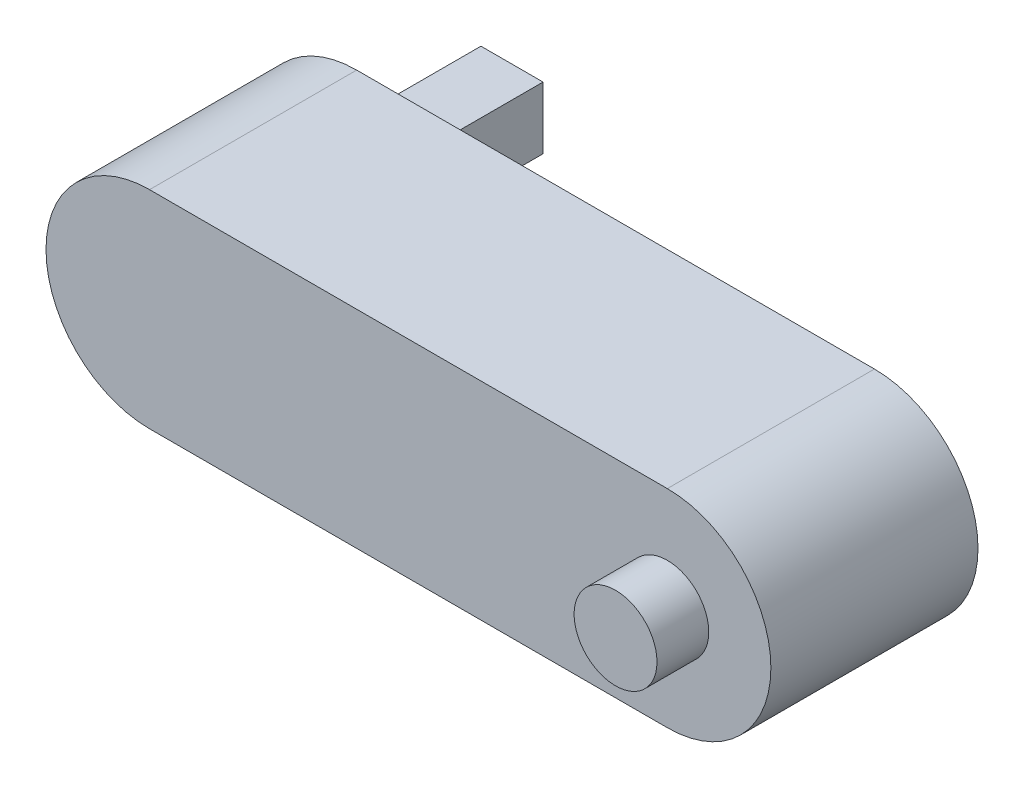
ISO-10303-21;
HEADER;
FILE_DESCRIPTION(('STEP AP214'),'2;1');
FILE_NAME('part.step','',(''),(''),'','','');
FILE_SCHEMA(('AUTOMOTIVE_DESIGN { 1 0 10303 214 1 1 1 1 }'));
ENDSEC;
DATA;
#1=APPLICATION_CONTEXT('core data for automotive mechanical design processes');
#2=APPLICATION_PROTOCOL_DEFINITION('international standard','automotive_design',2000,#1);
#3=PRODUCT_CONTEXT('',#1,'mechanical');
#4=PRODUCT('Part','Part','',(#3));
#5=PRODUCT_RELATED_PRODUCT_CATEGORY('part','',(#4));
#6=PRODUCT_DEFINITION_FORMATION('','',#4);
#7=PRODUCT_DEFINITION_CONTEXT('part definition',#1,'design');
#8=PRODUCT_DEFINITION('design','',#6,#7);
#9=PRODUCT_DEFINITION_SHAPE('','',#8);
#10=(LENGTH_UNIT() NAMED_UNIT(*) SI_UNIT(.MILLI.,.METRE.));
#11=(NAMED_UNIT(*) PLANE_ANGLE_UNIT() SI_UNIT($,.RADIAN.));
#12=(NAMED_UNIT(*) SI_UNIT($,.STERADIAN.) SOLID_ANGLE_UNIT());
#13=UNCERTAINTY_MEASURE_WITH_UNIT(LENGTH_MEASURE(1.E-05),#10,'distance_accuracy_value','');
#14=(GEOMETRIC_REPRESENTATION_CONTEXT(3) GLOBAL_UNCERTAINTY_ASSIGNED_CONTEXT((#13)) GLOBAL_UNIT_ASSIGNED_CONTEXT((#10,
#11,#12)) REPRESENTATION_CONTEXT('',''));
#15=CARTESIAN_POINT('',(0.,0.,0.));
#16=DIRECTION('',(0.,0.,1.));
#17=DIRECTION('',(1.,0.,0.));
#18=AXIS2_PLACEMENT_3D('',#15,#16,#17);
#19=CARTESIAN_POINT('',(0.,0.,0.));
#20=DIRECTION('',(0.,0.,1.));
#21=DIRECTION('',(1.,0.,0.));
#22=AXIS2_PLACEMENT_3D('',#19,#20,#21);
#23=PLANE('',#22);
#24=CARTESIAN_POINT('',(0.,0.,0.));
#25=DIRECTION('',(0.,0.,1.));
#26=DIRECTION('',(1.,0.,0.));
#27=AXIS2_PLACEMENT_3D('',#24,#25,#26);
#28=CIRCLE('',#27,10.);
#29=CARTESIAN_POINT('',(0.,10.,0.));
#30=VERTEX_POINT('',#29);
#31=CARTESIAN_POINT('',(0.,-10.,0.));
#32=VERTEX_POINT('',#31);
#33=EDGE_CURVE('E150',#30,#32,#28,.T.);
#34=ORIENTED_EDGE('',*,*,#33,.F.);
#35=DIRECTION('',(-1.,0.,0.));
#36=VECTOR('',#35,1.);
#37=CARTESIAN_POINT('',(0.,10.,0.));
#38=LINE('',#37,#36);
#39=CARTESIAN_POINT('',(50.,10.,0.));
#40=VERTEX_POINT('',#39);
#41=EDGE_CURVE('E157',#40,#30,#38,.T.);
#42=ORIENTED_EDGE('',*,*,#41,.F.);
#43=CARTESIAN_POINT('',(50.,0.,0.));
#44=DIRECTION('',(0.,0.,1.));
#45=DIRECTION('',(1.,0.,0.));
#46=AXIS2_PLACEMENT_3D('',#43,#44,#45);
#47=CIRCLE('',#46,10.);
#48=CARTESIAN_POINT('',(50.,-10.,0.));
#49=VERTEX_POINT('',#48);
#50=EDGE_CURVE('E173',#49,#40,#47,.T.);
#51=ORIENTED_EDGE('',*,*,#50,.F.);
#52=DIRECTION('',(1.,0.,0.));
#53=VECTOR('',#52,1.);
#54=CARTESIAN_POINT('',(0.,-10.,0.));
#55=LINE('',#54,#53);
#56=EDGE_CURVE('E170',#32,#49,#55,.T.);
#57=ORIENTED_EDGE('',*,*,#56,.F.);
#58=EDGE_LOOP('',(#34,#42,#51,#57));
#59=FACE_BOUND('',#58,.T.);
#60=DIRECTION('',(0.,1.,0.));
#61=VECTOR('',#60,1.);
#62=CARTESIAN_POINT('',(-3.,-3.,0.));
#63=LINE('',#62,#61);
#64=CARTESIAN_POINT('',(-3.,-3.,0.));
#65=VERTEX_POINT('',#64);
#66=CARTESIAN_POINT('',(-3.,3.,0.));
#67=VERTEX_POINT('',#66);
#68=EDGE_CURVE('E135',#65,#67,#63,.T.);
#69=ORIENTED_EDGE('',*,*,#68,.F.);
#70=DIRECTION('',(-1.,0.,0.));
#71=VECTOR('',#70,1.);
#72=CARTESIAN_POINT('',(3.,-3.,0.));
#73=LINE('',#72,#71);
#74=CARTESIAN_POINT('',(3.,-3.,0.));
#75=VERTEX_POINT('',#74);
#76=EDGE_CURVE('E132',#75,#65,#73,.T.);
#77=ORIENTED_EDGE('',*,*,#76,.F.);
#78=DIRECTION('',(0.,-1.,0.));
#79=VECTOR('',#78,1.);
#80=CARTESIAN_POINT('',(3.,-3.,0.));
#81=LINE('',#80,#79);
#82=CARTESIAN_POINT('',(3.,3.,0.));
#83=VERTEX_POINT('',#82);
#84=EDGE_CURVE('E68',#83,#75,#81,.T.);
#85=ORIENTED_EDGE('',*,*,#84,.F.);
#86=DIRECTION('',(1.,0.,0.));
#87=VECTOR('',#86,1.);
#88=CARTESIAN_POINT('',(3.,3.,0.));
#89=LINE('',#88,#87);
#90=EDGE_CURVE('E63',#67,#83,#89,.T.);
#91=ORIENTED_EDGE('',*,*,#90,.F.);
#92=EDGE_LOOP('',(#69,#77,#85,#91));
#93=FACE_BOUND('',#92,.T.);
#94=ADVANCED_FACE('F47',(#59,#93),#23,.F.);
#95=CARTESIAN_POINT('',(0.,0.,20.));
#96=DIRECTION('',(0.,0.,-1.));
#97=DIRECTION('',(-1.,0.,0.));
#98=AXIS2_PLACEMENT_3D('',#95,#96,#97);
#99=CYLINDRICAL_SURFACE('',#98,10.);
#100=ORIENTED_EDGE('',*,*,#33,.T.);
#101=DIRECTION('',(0.,0.,-1.));
#102=VECTOR('',#101,1.);
#103=CARTESIAN_POINT('',(0.,-10.,20.));
#104=LINE('',#103,#102);
#105=CARTESIAN_POINT('',(0.,-10.,20.));
#106=VERTEX_POINT('',#105);
#107=EDGE_CURVE('E11',#106,#32,#104,.T.);
#108=ORIENTED_EDGE('',*,*,#107,.F.);
#109=CARTESIAN_POINT('',(0.,0.,20.));
#110=DIRECTION('',(0.,0.,1.));
#111=DIRECTION('',(1.,0.,0.));
#112=AXIS2_PLACEMENT_3D('',#109,#110,#111);
#113=CIRCLE('',#112,10.);
#114=CARTESIAN_POINT('',(0.,10.,20.));
#115=VERTEX_POINT('',#114);
#116=EDGE_CURVE('E152',#115,#106,#113,.T.);
#117=ORIENTED_EDGE('',*,*,#116,.F.);
#118=DIRECTION('',(0.,0.,-1.));
#119=VECTOR('',#118,1.);
#120=CARTESIAN_POINT('',(0.,10.,20.));
#121=LINE('',#120,#119);
#122=EDGE_CURVE('E166',#115,#30,#121,.T.);
#123=ORIENTED_EDGE('',*,*,#122,.T.);
#124=EDGE_LOOP('',(#100,#108,#117,#123));
#125=FACE_BOUND('',#124,.T.);
#126=ADVANCED_FACE('F49',(#125),#99,.T.);
#127=CARTESIAN_POINT('',(0.,-10.,20.));
#128=DIRECTION('',(0.,1.,0.));
#129=DIRECTION('',(0.,0.,1.));
#130=AXIS2_PLACEMENT_3D('',#127,#128,#129);
#131=PLANE('',#130);
#132=ORIENTED_EDGE('',*,*,#56,.T.);
#133=DIRECTION('',(0.,0.,-1.));
#134=VECTOR('',#133,1.);
#135=CARTESIAN_POINT('',(50.,-10.,20.));
#136=LINE('',#135,#134);
#137=CARTESIAN_POINT('',(50.,-10.,20.));
#138=VERTEX_POINT('',#137);
#139=EDGE_CURVE('E56',#138,#49,#136,.T.);
#140=ORIENTED_EDGE('',*,*,#139,.F.);
#141=DIRECTION('',(1.,0.,0.));
#142=VECTOR('',#141,1.);
#143=CARTESIAN_POINT('',(0.,-10.,20.));
#144=LINE('',#143,#142);
#145=EDGE_CURVE('E156',#106,#138,#144,.T.);
#146=ORIENTED_EDGE('',*,*,#145,.F.);
#147=ORIENTED_EDGE('',*,*,#107,.T.);
#148=EDGE_LOOP('',(#132,#140,#146,#147));
#149=FACE_BOUND('',#148,.T.);
#150=ADVANCED_FACE('F205',(#149),#131,.F.);
#151=CARTESIAN_POINT('',(50.,0.,20.));
#152=DIRECTION('',(0.,0.,-1.));
#153=DIRECTION('',(-1.,0.,0.));
#154=AXIS2_PLACEMENT_3D('',#151,#152,#153);
#155=CYLINDRICAL_SURFACE('',#154,10.);
#156=ORIENTED_EDGE('',*,*,#50,.T.);
#157=DIRECTION('',(0.,0.,-1.));
#158=VECTOR('',#157,1.);
#159=CARTESIAN_POINT('',(50.,10.,20.));
#160=LINE('',#159,#158);
#161=CARTESIAN_POINT('',(50.,10.,20.));
#162=VERTEX_POINT('',#161);
#163=EDGE_CURVE('E181',#162,#40,#160,.T.);
#164=ORIENTED_EDGE('',*,*,#163,.F.);
#165=CARTESIAN_POINT('',(50.,0.,20.));
#166=DIRECTION('',(0.,0.,1.));
#167=DIRECTION('',(1.,0.,0.));
#168=AXIS2_PLACEMENT_3D('',#165,#166,#167);
#169=CIRCLE('',#168,10.);
#170=EDGE_CURVE('E160',#138,#162,#169,.T.);
#171=ORIENTED_EDGE('',*,*,#170,.F.);
#172=ORIENTED_EDGE('',*,*,#139,.T.);
#173=EDGE_LOOP('',(#156,#164,#171,#172));
#174=FACE_BOUND('',#173,.T.);
#175=ADVANCED_FACE('F190',(#174),#155,.T.);
#176=CARTESIAN_POINT('',(0.,10.,20.));
#177=DIRECTION('',(0.,-1.,0.));
#178=DIRECTION('',(0.,0.,-1.));
#179=AXIS2_PLACEMENT_3D('',#176,#177,#178);
#180=PLANE('',#179);
#181=ORIENTED_EDGE('',*,*,#41,.T.);
#182=ORIENTED_EDGE('',*,*,#122,.F.);
#183=DIRECTION('',(-1.,0.,0.));
#184=VECTOR('',#183,1.);
#185=CARTESIAN_POINT('',(0.,10.,20.));
#186=LINE('',#185,#184);
#187=EDGE_CURVE('E163',#162,#115,#186,.T.);
#188=ORIENTED_EDGE('',*,*,#187,.F.);
#189=ORIENTED_EDGE('',*,*,#163,.T.);
#190=EDGE_LOOP('',(#181,#182,#188,#189));
#191=FACE_BOUND('',#190,.T.);
#192=ADVANCED_FACE('F198',(#191),#180,.F.);
#193=CARTESIAN_POINT('',(0.,0.,20.));
#194=DIRECTION('',(0.,0.,1.));
#195=DIRECTION('',(1.,0.,0.));
#196=AXIS2_PLACEMENT_3D('',#193,#194,#195);
#197=PLANE('',#196);
#198=CARTESIAN_POINT('',(50.,0.,20.));
#199=DIRECTION('',(0.,0.,1.));
#200=DIRECTION('',(1.,0.,0.));
#201=AXIS2_PLACEMENT_3D('',#198,#199,#200);
#202=CIRCLE('',#201,4.00000000000001);
#203=CARTESIAN_POINT('',(54.,0.,20.));
#204=VERTEX_POINT('',#203);
#205=EDGE_CURVE('E137',#204,#204,#202,.T.);
#206=ORIENTED_EDGE('',*,*,#205,.F.);
#207=EDGE_LOOP('',(#206));
#208=FACE_BOUND('',#207,.T.);
#209=ORIENTED_EDGE('',*,*,#116,.T.);
#210=ORIENTED_EDGE('',*,*,#145,.T.);
#211=ORIENTED_EDGE('',*,*,#170,.T.);
#212=ORIENTED_EDGE('',*,*,#187,.T.);
#213=EDGE_LOOP('',(#209,#210,#211,#212));
#214=FACE_BOUND('',#213,.T.);
#215=ADVANCED_FACE('F204',(#208,#214),#197,.T.);
#216=CARTESIAN_POINT('',(50.,0.,25.));
#217=DIRECTION('',(0.,0.,-1.));
#218=DIRECTION('',(-1.,0.,0.));
#219=AXIS2_PLACEMENT_3D('',#216,#217,#218);
#220=CYLINDRICAL_SURFACE('',#219,4.00000000000001);
#221=CARTESIAN_POINT('',(50.,0.,25.));
#222=DIRECTION('',(0.,0.,1.));
#223=DIRECTION('',(1.,0.,0.));
#224=AXIS2_PLACEMENT_3D('',#221,#222,#223);
#225=CIRCLE('',#224,4.00000000000001);
#226=CARTESIAN_POINT('',(54.,0.,25.));
#227=VERTEX_POINT('',#226);
#228=EDGE_CURVE('E142',#227,#227,#225,.T.);
#229=ORIENTED_EDGE('',*,*,#228,.F.);
#230=EDGE_LOOP('',(#229));
#231=FACE_BOUND('',#230,.T.);
#232=ORIENTED_EDGE('',*,*,#205,.T.);
#233=EDGE_LOOP('',(#232));
#234=FACE_BOUND('',#233,.T.);
#235=ADVANCED_FACE('F225',(#231,#234),#220,.T.);
#236=CARTESIAN_POINT('',(0.,0.,25.));
#237=DIRECTION('',(0.,0.,1.));
#238=DIRECTION('',(1.,0.,0.));
#239=AXIS2_PLACEMENT_3D('',#236,#237,#238);
#240=PLANE('',#239);
#241=ORIENTED_EDGE('',*,*,#228,.T.);
#242=EDGE_LOOP('',(#241));
#243=FACE_BOUND('',#242,.T.);
#244=ADVANCED_FACE('F230',(#243),#240,.T.);
#245=CARTESIAN_POINT('',(-3.,-3.,-15.));
#246=DIRECTION('',(1.,0.,0.));
#247=DIRECTION('',(0.,0.,-1.));
#248=AXIS2_PLACEMENT_3D('',#245,#246,#247);
#249=PLANE('',#248);
#250=ORIENTED_EDGE('',*,*,#68,.T.);
#251=DIRECTION('',(0.,0.,1.));
#252=VECTOR('',#251,1.);
#253=CARTESIAN_POINT('',(-3.,3.,-15.));
#254=LINE('',#253,#252);
#255=CARTESIAN_POINT('',(-3.,3.,-15.));
#256=VERTEX_POINT('',#255);
#257=EDGE_CURVE('E114',#256,#67,#254,.T.);
#258=ORIENTED_EDGE('',*,*,#257,.F.);
#259=DIRECTION('',(0.,1.,0.));
#260=VECTOR('',#259,1.);
#261=CARTESIAN_POINT('',(-3.,-3.,-15.));
#262=LINE('',#261,#260);
#263=CARTESIAN_POINT('',(-3.,-3.,-15.));
#264=VERTEX_POINT('',#263);
#265=EDGE_CURVE('E122',#264,#256,#262,.T.);
#266=ORIENTED_EDGE('',*,*,#265,.F.);
#267=DIRECTION('',(0.,0.,1.));
#268=VECTOR('',#267,1.);
#269=CARTESIAN_POINT('',(-3.,-3.,-15.));
#270=LINE('',#269,#268);
#271=EDGE_CURVE('E322',#264,#65,#270,.T.);
#272=ORIENTED_EDGE('',*,*,#271,.T.);
#273=EDGE_LOOP('',(#250,#258,#266,#272));
#274=FACE_BOUND('',#273,.T.);
#275=ADVANCED_FACE('F134',(#274),#249,.F.);
#276=CARTESIAN_POINT('',(3.,3.,-15.));
#277=DIRECTION('',(0.,-1.,0.));
#278=DIRECTION('',(0.,0.,-1.));
#279=AXIS2_PLACEMENT_3D('',#276,#277,#278);
#280=PLANE('',#279);
#281=ORIENTED_EDGE('',*,*,#90,.T.);
#282=DIRECTION('',(0.,0.,1.));
#283=VECTOR('',#282,1.);
#284=CARTESIAN_POINT('',(3.,3.,-15.));
#285=LINE('',#284,#283);
#286=CARTESIAN_POINT('',(3.,3.,-15.));
#287=VERTEX_POINT('',#286);
#288=EDGE_CURVE('E117',#287,#83,#285,.T.);
#289=ORIENTED_EDGE('',*,*,#288,.F.);
#290=DIRECTION('',(1.,0.,0.));
#291=VECTOR('',#290,1.);
#292=CARTESIAN_POINT('',(3.,3.,-15.));
#293=LINE('',#292,#291);
#294=EDGE_CURVE('E110',#256,#287,#293,.T.);
#295=ORIENTED_EDGE('',*,*,#294,.F.);
#296=ORIENTED_EDGE('',*,*,#257,.T.);
#297=EDGE_LOOP('',(#281,#289,#295,#296));
#298=FACE_BOUND('',#297,.T.);
#299=ADVANCED_FACE('F112',(#298),#280,.F.);
#300=CARTESIAN_POINT('',(3.,-3.,-15.));
#301=DIRECTION('',(-1.,0.,0.));
#302=DIRECTION('',(0.,0.,1.));
#303=AXIS2_PLACEMENT_3D('',#300,#301,#302);
#304=PLANE('',#303);
#305=ORIENTED_EDGE('',*,*,#84,.T.);
#306=DIRECTION('',(0.,0.,1.));
#307=VECTOR('',#306,1.);
#308=CARTESIAN_POINT('',(3.,-3.,-15.));
#309=LINE('',#308,#307);
#310=CARTESIAN_POINT('',(3.,-3.,-15.));
#311=VERTEX_POINT('',#310);
#312=EDGE_CURVE('E144',#311,#75,#309,.T.);
#313=ORIENTED_EDGE('',*,*,#312,.F.);
#314=DIRECTION('',(0.,-1.,0.));
#315=VECTOR('',#314,1.);
#316=CARTESIAN_POINT('',(3.,-3.,-15.));
#317=LINE('',#316,#315);
#318=EDGE_CURVE('E121',#287,#311,#317,.T.);
#319=ORIENTED_EDGE('',*,*,#318,.F.);
#320=ORIENTED_EDGE('',*,*,#288,.T.);
#321=EDGE_LOOP('',(#305,#313,#319,#320));
#322=FACE_BOUND('',#321,.T.);
#323=ADVANCED_FACE('F243',(#322),#304,.F.);
#324=CARTESIAN_POINT('',(3.,-3.,-15.));
#325=DIRECTION('',(0.,1.,0.));
#326=DIRECTION('',(0.,0.,1.));
#327=AXIS2_PLACEMENT_3D('',#324,#325,#326);
#328=PLANE('',#327);
#329=ORIENTED_EDGE('',*,*,#76,.T.);
#330=ORIENTED_EDGE('',*,*,#271,.F.);
#331=DIRECTION('',(-1.,0.,0.));
#332=VECTOR('',#331,1.);
#333=CARTESIAN_POINT('',(3.,-3.,-15.));
#334=LINE('',#333,#332);
#335=EDGE_CURVE('E127',#311,#264,#334,.T.);
#336=ORIENTED_EDGE('',*,*,#335,.F.);
#337=ORIENTED_EDGE('',*,*,#312,.T.);
#338=EDGE_LOOP('',(#329,#330,#336,#337));
#339=FACE_BOUND('',#338,.T.);
#340=ADVANCED_FACE('F246',(#339),#328,.F.);
#341=CARTESIAN_POINT('',(0.,0.,-15.));
#342=DIRECTION('',(0.,0.,1.));
#343=DIRECTION('',(1.,0.,0.));
#344=AXIS2_PLACEMENT_3D('',#341,#342,#343);
#345=PLANE('',#344);
#346=ORIENTED_EDGE('',*,*,#265,.T.);
#347=ORIENTED_EDGE('',*,*,#294,.T.);
#348=ORIENTED_EDGE('',*,*,#318,.T.);
#349=ORIENTED_EDGE('',*,*,#335,.T.);
#350=EDGE_LOOP('',(#346,#347,#348,#349));
#351=FACE_BOUND('',#350,.T.);
#352=ADVANCED_FACE('F125',(#351),#345,.F.);
#353=CLOSED_SHELL('',(#94,#126,#150,#175,#192,#215,#235,#244,#275,#299,#323,#340,#352));
#354=MANIFOLD_SOLID_BREP('B2',#353);
#355=ADVANCED_BREP_SHAPE_REPRESENTATION('',(#18,#354),#14);
#356=SHAPE_DEFINITION_REPRESENTATION(#9,#355);
ENDSEC;
END-ISO-10303-21;
